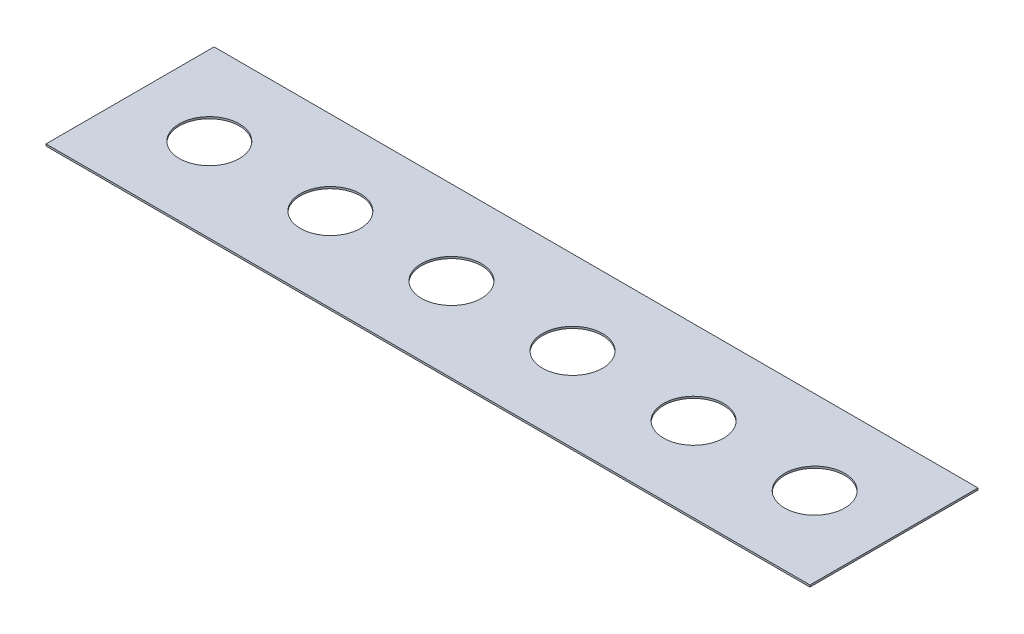
ISO-10303-21;
HEADER;
FILE_DESCRIPTION(('STEP AP214'),'2;1');
FILE_NAME('part.step','',(''),(''),'','','');
FILE_SCHEMA(('AUTOMOTIVE_DESIGN { 1 0 10303 214 1 1 1 1 }'));
ENDSEC;
DATA;
#1=APPLICATION_CONTEXT('core data for automotive mechanical design processes');
#2=APPLICATION_PROTOCOL_DEFINITION('international standard','automotive_design',2000,#1);
#3=PRODUCT_CONTEXT('',#1,'mechanical');
#4=PRODUCT('Part','Part','',(#3));
#5=PRODUCT_RELATED_PRODUCT_CATEGORY('part','',(#4));
#6=PRODUCT_DEFINITION_FORMATION('','',#4);
#7=PRODUCT_DEFINITION_CONTEXT('part definition',#1,'design');
#8=PRODUCT_DEFINITION('design','',#6,#7);
#9=PRODUCT_DEFINITION_SHAPE('','',#8);
#10=(LENGTH_UNIT() NAMED_UNIT(*) SI_UNIT(.MILLI.,.METRE.));
#11=(NAMED_UNIT(*) PLANE_ANGLE_UNIT() SI_UNIT($,.RADIAN.));
#12=(NAMED_UNIT(*) SI_UNIT($,.STERADIAN.) SOLID_ANGLE_UNIT());
#13=UNCERTAINTY_MEASURE_WITH_UNIT(LENGTH_MEASURE(1.E-05),#10,'distance_accuracy_value','');
#14=(GEOMETRIC_REPRESENTATION_CONTEXT(3) GLOBAL_UNCERTAINTY_ASSIGNED_CONTEXT((#13)) GLOBAL_UNIT_ASSIGNED_CONTEXT((#10,
#11,#12)) REPRESENTATION_CONTEXT('',''));
#15=CARTESIAN_POINT('',(0.,0.,0.));
#16=DIRECTION('',(0.,0.,1.));
#17=DIRECTION('',(1.,0.,0.));
#18=AXIS2_PLACEMENT_3D('',#15,#16,#17);
#19=CARTESIAN_POINT('',(0.,1.5748,0.));
#20=DIRECTION('',(0.,-1.,0.));
#21=DIRECTION('',(0.,0.,-1.));
#22=AXIS2_PLACEMENT_3D('',#19,#20,#21);
#23=PLANE('',#22);
#24=DIRECTION('',(0.,0.,-1.));
#25=VECTOR('',#24,1.);
#26=CARTESIAN_POINT('',(317.5,1.5748,69.8499999999999));
#27=LINE('',#26,#25);
#28=CARTESIAN_POINT('',(317.5,1.5748,69.8499999999999));
#29=VERTEX_POINT('',#28);
#30=CARTESIAN_POINT('',(317.5,1.5748,-69.8499999999999));
#31=VERTEX_POINT('',#30);
#32=EDGE_CURVE('E85',#29,#31,#27,.T.);
#33=ORIENTED_EDGE('',*,*,#32,.T.);
#34=DIRECTION('',(-1.,0.,0.));
#35=VECTOR('',#34,1.);
#36=CARTESIAN_POINT('',(-317.5,1.5748,-69.8499999999999));
#37=LINE('',#36,#35);
#38=CARTESIAN_POINT('',(-317.5,1.5748,-69.8499999999999));
#39=VERTEX_POINT('',#38);
#40=EDGE_CURVE('E80',#31,#39,#37,.T.);
#41=ORIENTED_EDGE('',*,*,#40,.T.);
#42=DIRECTION('',(0.,0.,1.));
#43=VECTOR('',#42,1.);
#44=CARTESIAN_POINT('',(-317.5,1.5748,69.8500000000001));
#45=LINE('',#44,#43);
#46=CARTESIAN_POINT('',(-317.5,1.5748,69.8500000000001));
#47=VERTEX_POINT('',#46);
#48=EDGE_CURVE('E83',#39,#47,#45,.T.);
#49=ORIENTED_EDGE('',*,*,#48,.T.);
#50=DIRECTION('',(1.,0.,0.));
#51=VECTOR('',#50,1.);
#52=CARTESIAN_POINT('',(-317.5,1.5748,69.8500000000001));
#53=LINE('',#52,#51);
#54=EDGE_CURVE('E50',#47,#29,#53,.T.);
#55=ORIENTED_EDGE('',*,*,#54,.T.);
#56=EDGE_LOOP('',(#33,#41,#49,#55));
#57=FACE_BOUND('',#56,.T.);
#58=CARTESIAN_POINT('',(-251.587,1.5748,0.));
#59=DIRECTION('',(0.,1.,0.));
#60=DIRECTION('',(0.,0.,1.));
#61=AXIS2_PLACEMENT_3D('',#58,#59,#60);
#62=CIRCLE('',#61,24.9936);
#63=CARTESIAN_POINT('',(-251.587,1.5748,24.9936));
#64=VERTEX_POINT('',#63);
#65=EDGE_CURVE('E100',#64,#64,#62,.T.);
#66=ORIENTED_EDGE('',*,*,#65,.F.);
#67=EDGE_LOOP('',(#66));
#68=FACE_BOUND('',#67,.T.);
#69=CARTESIAN_POINT('',(-150.9522,1.5748,0.));
#70=DIRECTION('',(0.,1.,0.));
#71=DIRECTION('',(0.,0.,1.));
#72=AXIS2_PLACEMENT_3D('',#69,#70,#71);
#73=CIRCLE('',#72,24.9935999999999);
#74=CARTESIAN_POINT('',(-150.9522,1.5748,24.9935999999999));
#75=VERTEX_POINT('',#74);
#76=EDGE_CURVE('E115',#75,#75,#73,.T.);
#77=ORIENTED_EDGE('',*,*,#76,.F.);
#78=EDGE_LOOP('',(#77));
#79=FACE_BOUND('',#78,.T.);
#80=CARTESIAN_POINT('',(-50.3174000000001,1.5748,0.));
#81=DIRECTION('',(0.,1.,0.));
#82=DIRECTION('',(0.,0.,1.));
#83=AXIS2_PLACEMENT_3D('',#80,#81,#82);
#84=CIRCLE('',#83,24.9936);
#85=CARTESIAN_POINT('',(-50.3174000000001,1.5748,24.9936));
#86=VERTEX_POINT('',#85);
#87=EDGE_CURVE('E121',#86,#86,#84,.T.);
#88=ORIENTED_EDGE('',*,*,#87,.F.);
#89=EDGE_LOOP('',(#88));
#90=FACE_BOUND('',#89,.T.);
#91=CARTESIAN_POINT('',(50.3173999999998,1.5748,0.));
#92=DIRECTION('',(0.,1.,0.));
#93=DIRECTION('',(0.,0.,1.));
#94=AXIS2_PLACEMENT_3D('',#91,#92,#93);
#95=CIRCLE('',#94,24.9936);
#96=CARTESIAN_POINT('',(50.3173999999998,1.5748,24.9936));
#97=VERTEX_POINT('',#96);
#98=EDGE_CURVE('E127',#97,#97,#95,.T.);
#99=ORIENTED_EDGE('',*,*,#98,.F.);
#100=EDGE_LOOP('',(#99));
#101=FACE_BOUND('',#100,.T.);
#102=CARTESIAN_POINT('',(150.9522,1.5748,0.));
#103=DIRECTION('',(0.,1.,0.));
#104=DIRECTION('',(0.,0.,1.));
#105=AXIS2_PLACEMENT_3D('',#102,#103,#104);
#106=CIRCLE('',#105,24.9936);
#107=CARTESIAN_POINT('',(150.9522,1.5748,24.9936));
#108=VERTEX_POINT('',#107);
#109=EDGE_CURVE('E133',#108,#108,#106,.T.);
#110=ORIENTED_EDGE('',*,*,#109,.F.);
#111=EDGE_LOOP('',(#110));
#112=FACE_BOUND('',#111,.T.);
#113=CARTESIAN_POINT('',(251.587,1.5748,0.));
#114=DIRECTION('',(0.,1.,0.));
#115=DIRECTION('',(0.,0.,1.));
#116=AXIS2_PLACEMENT_3D('',#113,#114,#115);
#117=CIRCLE('',#116,24.9935999999999);
#118=CARTESIAN_POINT('',(251.587,1.5748,24.9935999999999));
#119=VERTEX_POINT('',#118);
#120=EDGE_CURVE('E139',#119,#119,#117,.T.);
#121=ORIENTED_EDGE('',*,*,#120,.F.);
#122=EDGE_LOOP('',(#121));
#123=FACE_BOUND('',#122,.T.);
#124=ADVANCED_FACE('F33',(#57,#68,#79,#90,#101,#112,#123),#23,.F.);
#125=CARTESIAN_POINT('',(0.,0.,0.));
#126=DIRECTION('',(0.,-1.,0.));
#127=DIRECTION('',(0.,0.,-1.));
#128=AXIS2_PLACEMENT_3D('',#125,#126,#127);
#129=PLANE('',#128);
#130=CARTESIAN_POINT('',(150.9522,0.,0.));
#131=DIRECTION('',(0.,1.,0.));
#132=DIRECTION('',(0.,0.,1.));
#133=AXIS2_PLACEMENT_3D('',#130,#131,#132);
#134=CIRCLE('',#133,24.9936);
#135=CARTESIAN_POINT('',(150.9522,0.,24.9936));
#136=VERTEX_POINT('',#135);
#137=EDGE_CURVE('E136',#136,#136,#134,.T.);
#138=ORIENTED_EDGE('',*,*,#137,.T.);
#139=EDGE_LOOP('',(#138));
#140=FACE_BOUND('',#139,.T.);
#141=CARTESIAN_POINT('',(-50.3174000000001,0.,0.));
#142=DIRECTION('',(0.,1.,0.));
#143=DIRECTION('',(0.,0.,1.));
#144=AXIS2_PLACEMENT_3D('',#141,#142,#143);
#145=CIRCLE('',#144,24.9936);
#146=CARTESIAN_POINT('',(-50.3174000000001,0.,24.9936));
#147=VERTEX_POINT('',#146);
#148=EDGE_CURVE('E124',#147,#147,#145,.T.);
#149=ORIENTED_EDGE('',*,*,#148,.T.);
#150=EDGE_LOOP('',(#149));
#151=FACE_BOUND('',#150,.T.);
#152=CARTESIAN_POINT('',(-251.587,0.,0.));
#153=DIRECTION('',(0.,1.,0.));
#154=DIRECTION('',(0.,0.,1.));
#155=AXIS2_PLACEMENT_3D('',#152,#153,#154);
#156=CIRCLE('',#155,24.9936);
#157=CARTESIAN_POINT('',(-251.587,0.,24.9936));
#158=VERTEX_POINT('',#157);
#159=EDGE_CURVE('E112',#158,#158,#156,.T.);
#160=ORIENTED_EDGE('',*,*,#159,.T.);
#161=EDGE_LOOP('',(#160));
#162=FACE_BOUND('',#161,.T.);
#163=DIRECTION('',(0.,0.,-1.));
#164=VECTOR('',#163,1.);
#165=CARTESIAN_POINT('',(317.5,0.,69.8499999999999));
#166=LINE('',#165,#164);
#167=CARTESIAN_POINT('',(317.5,0.,69.8499999999999));
#168=VERTEX_POINT('',#167);
#169=CARTESIAN_POINT('',(317.5,0.,-69.8499999999999));
#170=VERTEX_POINT('',#169);
#171=EDGE_CURVE('E97',#168,#170,#166,.T.);
#172=ORIENTED_EDGE('',*,*,#171,.F.);
#173=DIRECTION('',(1.,0.,0.));
#174=VECTOR('',#173,1.);
#175=CARTESIAN_POINT('',(-317.5,0.,69.8500000000001));
#176=LINE('',#175,#174);
#177=CARTESIAN_POINT('',(-317.5,0.,69.8500000000001));
#178=VERTEX_POINT('',#177);
#179=EDGE_CURVE('E73',#178,#168,#176,.T.);
#180=ORIENTED_EDGE('',*,*,#179,.F.);
#181=DIRECTION('',(0.,0.,1.));
#182=VECTOR('',#181,1.);
#183=CARTESIAN_POINT('',(-317.5,0.,69.8500000000001));
#184=LINE('',#183,#182);
#185=CARTESIAN_POINT('',(-317.5,0.,-69.8499999999999));
#186=VERTEX_POINT('',#185);
#187=EDGE_CURVE('E67',#186,#178,#184,.T.);
#188=ORIENTED_EDGE('',*,*,#187,.F.);
#189=DIRECTION('',(-1.,0.,0.));
#190=VECTOR('',#189,1.);
#191=CARTESIAN_POINT('',(-317.5,0.,-69.8499999999999));
#192=LINE('',#191,#190);
#193=EDGE_CURVE('E89',#170,#186,#192,.T.);
#194=ORIENTED_EDGE('',*,*,#193,.F.);
#195=EDGE_LOOP('',(#172,#180,#188,#194));
#196=FACE_BOUND('',#195,.T.);
#197=CARTESIAN_POINT('',(-150.9522,0.,0.));
#198=DIRECTION('',(0.,1.,0.));
#199=DIRECTION('',(0.,0.,1.));
#200=AXIS2_PLACEMENT_3D('',#197,#198,#199);
#201=CIRCLE('',#200,24.9935999999999);
#202=CARTESIAN_POINT('',(-150.9522,0.,24.9935999999999));
#203=VERTEX_POINT('',#202);
#204=EDGE_CURVE('E118',#203,#203,#201,.T.);
#205=ORIENTED_EDGE('',*,*,#204,.T.);
#206=EDGE_LOOP('',(#205));
#207=FACE_BOUND('',#206,.T.);
#208=CARTESIAN_POINT('',(50.3173999999998,0.,0.));
#209=DIRECTION('',(0.,1.,0.));
#210=DIRECTION('',(0.,0.,1.));
#211=AXIS2_PLACEMENT_3D('',#208,#209,#210);
#212=CIRCLE('',#211,24.9936);
#213=CARTESIAN_POINT('',(50.3173999999998,0.,24.9936));
#214=VERTEX_POINT('',#213);
#215=EDGE_CURVE('E130',#214,#214,#212,.T.);
#216=ORIENTED_EDGE('',*,*,#215,.T.);
#217=EDGE_LOOP('',(#216));
#218=FACE_BOUND('',#217,.T.);
#219=CARTESIAN_POINT('',(251.587,0.,0.));
#220=DIRECTION('',(0.,1.,0.));
#221=DIRECTION('',(0.,0.,1.));
#222=AXIS2_PLACEMENT_3D('',#219,#220,#221);
#223=CIRCLE('',#222,24.9935999999999);
#224=CARTESIAN_POINT('',(251.587,0.,24.9935999999999));
#225=VERTEX_POINT('',#224);
#226=EDGE_CURVE('E142',#225,#225,#223,.T.);
#227=ORIENTED_EDGE('',*,*,#226,.T.);
#228=EDGE_LOOP('',(#227));
#229=FACE_BOUND('',#228,.T.);
#230=ADVANCED_FACE('F108',(#140,#151,#162,#196,#207,#218,#229),#129,.T.);
#231=CARTESIAN_POINT('',(317.5,1.5748,69.8499999999999));
#232=DIRECTION('',(-1.,0.,0.));
#233=DIRECTION('',(0.,0.,1.));
#234=AXIS2_PLACEMENT_3D('',#231,#232,#233);
#235=PLANE('',#234);
#236=ORIENTED_EDGE('',*,*,#171,.T.);
#237=DIRECTION('',(0.,-1.,0.));
#238=VECTOR('',#237,1.);
#239=CARTESIAN_POINT('',(317.5,1.5748,-69.8499999999999));
#240=LINE('',#239,#238);
#241=EDGE_CURVE('E11',#31,#170,#240,.T.);
#242=ORIENTED_EDGE('',*,*,#241,.F.);
#243=ORIENTED_EDGE('',*,*,#32,.F.);
#244=DIRECTION('',(0.,-1.,0.));
#245=VECTOR('',#244,1.);
#246=CARTESIAN_POINT('',(317.5,1.5748,69.8499999999999));
#247=LINE('',#246,#245);
#248=EDGE_CURVE('E93',#29,#168,#247,.T.);
#249=ORIENTED_EDGE('',*,*,#248,.T.);
#250=EDGE_LOOP('',(#236,#242,#243,#249));
#251=FACE_BOUND('',#250,.T.);
#252=ADVANCED_FACE('F35',(#251),#235,.F.);
#253=CARTESIAN_POINT('',(-317.5,1.5748,-69.8499999999999));
#254=DIRECTION('',(0.,0.,1.));
#255=DIRECTION('',(1.,0.,0.));
#256=AXIS2_PLACEMENT_3D('',#253,#254,#255);
#257=PLANE('',#256);
#258=ORIENTED_EDGE('',*,*,#193,.T.);
#259=DIRECTION('',(0.,-1.,0.));
#260=VECTOR('',#259,1.);
#261=CARTESIAN_POINT('',(-317.5,1.5748,-69.8499999999999));
#262=LINE('',#261,#260);
#263=EDGE_CURVE('E42',#39,#186,#262,.T.);
#264=ORIENTED_EDGE('',*,*,#263,.F.);
#265=ORIENTED_EDGE('',*,*,#40,.F.);
#266=ORIENTED_EDGE('',*,*,#241,.T.);
#267=EDGE_LOOP('',(#258,#264,#265,#266));
#268=FACE_BOUND('',#267,.T.);
#269=ADVANCED_FACE('F88',(#268),#257,.F.);
#270=CARTESIAN_POINT('',(-317.5,1.5748,69.8500000000001));
#271=DIRECTION('',(1.,0.,0.));
#272=DIRECTION('',(0.,0.,-1.));
#273=AXIS2_PLACEMENT_3D('',#270,#271,#272);
#274=PLANE('',#273);
#275=ORIENTED_EDGE('',*,*,#187,.T.);
#276=DIRECTION('',(0.,-1.,0.));
#277=VECTOR('',#276,1.);
#278=CARTESIAN_POINT('',(-317.5,1.5748,69.8500000000001));
#279=LINE('',#278,#277);
#280=EDGE_CURVE('E90',#47,#178,#279,.T.);
#281=ORIENTED_EDGE('',*,*,#280,.F.);
#282=ORIENTED_EDGE('',*,*,#48,.F.);
#283=ORIENTED_EDGE('',*,*,#263,.T.);
#284=EDGE_LOOP('',(#275,#281,#282,#283));
#285=FACE_BOUND('',#284,.T.);
#286=ADVANCED_FACE('F91',(#285),#274,.F.);
#287=CARTESIAN_POINT('',(-317.5,1.5748,69.8500000000001));
#288=DIRECTION('',(0.,0.,-1.));
#289=DIRECTION('',(-1.,0.,0.));
#290=AXIS2_PLACEMENT_3D('',#287,#288,#289);
#291=PLANE('',#290);
#292=ORIENTED_EDGE('',*,*,#179,.T.);
#293=ORIENTED_EDGE('',*,*,#248,.F.);
#294=ORIENTED_EDGE('',*,*,#54,.F.);
#295=ORIENTED_EDGE('',*,*,#280,.T.);
#296=EDGE_LOOP('',(#292,#293,#294,#295));
#297=FACE_BOUND('',#296,.T.);
#298=ADVANCED_FACE('F105',(#297),#291,.F.);
#299=CARTESIAN_POINT('',(-251.587,1.5748,0.));
#300=DIRECTION('',(0.,-1.,0.));
#301=DIRECTION('',(0.,0.,-1.));
#302=AXIS2_PLACEMENT_3D('',#299,#300,#301);
#303=CYLINDRICAL_SURFACE('',#302,24.9936);
#304=ORIENTED_EDGE('',*,*,#65,.T.);
#305=EDGE_LOOP('',(#304));
#306=FACE_BOUND('',#305,.T.);
#307=ORIENTED_EDGE('',*,*,#159,.F.);
#308=EDGE_LOOP('',(#307));
#309=FACE_BOUND('',#308,.T.);
#310=ADVANCED_FACE('F159',(#306,#309),#303,.F.);
#311=CARTESIAN_POINT('',(-150.9522,1.5748,0.));
#312=DIRECTION('',(0.,-1.,0.));
#313=DIRECTION('',(0.,0.,-1.));
#314=AXIS2_PLACEMENT_3D('',#311,#312,#313);
#315=CYLINDRICAL_SURFACE('',#314,24.9935999999999);
#316=ORIENTED_EDGE('',*,*,#76,.T.);
#317=EDGE_LOOP('',(#316));
#318=FACE_BOUND('',#317,.T.);
#319=ORIENTED_EDGE('',*,*,#204,.F.);
#320=EDGE_LOOP('',(#319));
#321=FACE_BOUND('',#320,.T.);
#322=ADVANCED_FACE('F205',(#318,#321),#315,.F.);
#323=CARTESIAN_POINT('',(-50.3174000000001,1.5748,0.));
#324=DIRECTION('',(0.,-1.,0.));
#325=DIRECTION('',(0.,0.,-1.));
#326=AXIS2_PLACEMENT_3D('',#323,#324,#325);
#327=CYLINDRICAL_SURFACE('',#326,24.9936);
#328=ORIENTED_EDGE('',*,*,#87,.T.);
#329=EDGE_LOOP('',(#328));
#330=FACE_BOUND('',#329,.T.);
#331=ORIENTED_EDGE('',*,*,#148,.F.);
#332=EDGE_LOOP('',(#331));
#333=FACE_BOUND('',#332,.T.);
#334=ADVANCED_FACE('F213',(#330,#333),#327,.F.);
#335=CARTESIAN_POINT('',(50.3173999999998,1.5748,0.));
#336=DIRECTION('',(0.,-1.,0.));
#337=DIRECTION('',(0.,0.,-1.));
#338=AXIS2_PLACEMENT_3D('',#335,#336,#337);
#339=CYLINDRICAL_SURFACE('',#338,24.9936);
#340=ORIENTED_EDGE('',*,*,#98,.T.);
#341=EDGE_LOOP('',(#340));
#342=FACE_BOUND('',#341,.T.);
#343=ORIENTED_EDGE('',*,*,#215,.F.);
#344=EDGE_LOOP('',(#343));
#345=FACE_BOUND('',#344,.T.);
#346=ADVANCED_FACE('F221',(#342,#345),#339,.F.);
#347=CARTESIAN_POINT('',(150.9522,1.5748,0.));
#348=DIRECTION('',(0.,-1.,0.));
#349=DIRECTION('',(0.,0.,-1.));
#350=AXIS2_PLACEMENT_3D('',#347,#348,#349);
#351=CYLINDRICAL_SURFACE('',#350,24.9936);
#352=ORIENTED_EDGE('',*,*,#109,.T.);
#353=EDGE_LOOP('',(#352));
#354=FACE_BOUND('',#353,.T.);
#355=ORIENTED_EDGE('',*,*,#137,.F.);
#356=EDGE_LOOP('',(#355));
#357=FACE_BOUND('',#356,.T.);
#358=ADVANCED_FACE('F230',(#354,#357),#351,.F.);
#359=CARTESIAN_POINT('',(251.587,1.5748,0.));
#360=DIRECTION('',(0.,-1.,0.));
#361=DIRECTION('',(0.,0.,-1.));
#362=AXIS2_PLACEMENT_3D('',#359,#360,#361);
#363=CYLINDRICAL_SURFACE('',#362,24.9935999999999);
#364=ORIENTED_EDGE('',*,*,#120,.T.);
#365=EDGE_LOOP('',(#364));
#366=FACE_BOUND('',#365,.T.);
#367=ORIENTED_EDGE('',*,*,#226,.F.);
#368=EDGE_LOOP('',(#367));
#369=FACE_BOUND('',#368,.T.);
#370=ADVANCED_FACE('F148',(#366,#369),#363,.F.);
#371=CLOSED_SHELL('',(#124,#230,#252,#269,#286,#298,#310,#322,#334,#346,#358,#370));
#372=MANIFOLD_SOLID_BREP('B2',#371);
#373=ADVANCED_BREP_SHAPE_REPRESENTATION('',(#18,#372),#14);
#374=SHAPE_DEFINITION_REPRESENTATION(#9,#373);
ENDSEC;
END-ISO-10303-21;
